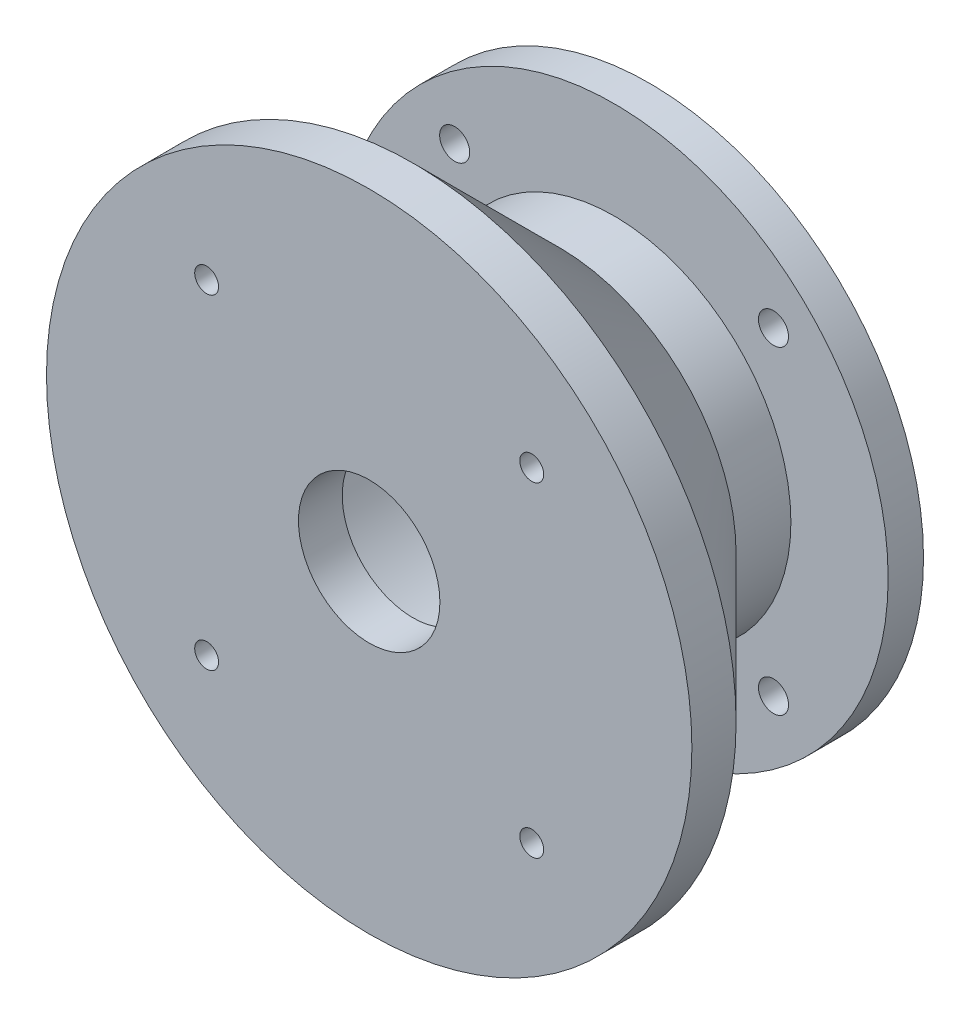
ISO-10303-21;
HEADER;
FILE_DESCRIPTION(('STEP AP214'),'2;1');
FILE_NAME('part.step','',(''),(''),'','','');
FILE_SCHEMA(('AUTOMOTIVE_DESIGN { 1 0 10303 214 1 1 1 1 }'));
ENDSEC;
DATA;
#1=APPLICATION_CONTEXT('core data for automotive mechanical design processes');
#2=APPLICATION_PROTOCOL_DEFINITION('international standard','automotive_design',2000,#1);
#3=PRODUCT_CONTEXT('',#1,'mechanical');
#4=PRODUCT('Part','Part','',(#3));
#5=PRODUCT_RELATED_PRODUCT_CATEGORY('part','',(#4));
#6=PRODUCT_DEFINITION_FORMATION('','',#4);
#7=PRODUCT_DEFINITION_CONTEXT('part definition',#1,'design');
#8=PRODUCT_DEFINITION('design','',#6,#7);
#9=PRODUCT_DEFINITION_SHAPE('','',#8);
#10=(LENGTH_UNIT() NAMED_UNIT(*) SI_UNIT(.MILLI.,.METRE.));
#11=(NAMED_UNIT(*) PLANE_ANGLE_UNIT() SI_UNIT($,.RADIAN.));
#12=(NAMED_UNIT(*) SI_UNIT($,.STERADIAN.) SOLID_ANGLE_UNIT());
#13=UNCERTAINTY_MEASURE_WITH_UNIT(LENGTH_MEASURE(1.E-05),#10,'distance_accuracy_value','');
#14=(GEOMETRIC_REPRESENTATION_CONTEXT(3) GLOBAL_UNCERTAINTY_ASSIGNED_CONTEXT((#13)) GLOBAL_UNIT_ASSIGNED_CONTEXT((#10,
#11,#12)) REPRESENTATION_CONTEXT('',''));
#15=CARTESIAN_POINT('',(0.,0.,0.));
#16=DIRECTION('',(0.,0.,1.));
#17=DIRECTION('',(1.,0.,0.));
#18=AXIS2_PLACEMENT_3D('',#15,#16,#17);
#19=CARTESIAN_POINT('',(138.38477631085,18.38477631085,126.6));
#20=DIRECTION('',(0.,0.,1.));
#21=DIRECTION('',(1.,0.,0.));
#22=AXIS2_PLACEMENT_3D('',#19,#20,#21);
#23=PLANE('',#22);
#24=CARTESIAN_POINT('',(138.38477631085,18.38477631085,126.6));
#25=DIRECTION('',(0.,0.,1.));
#26=DIRECTION('',(1.,0.,0.));
#27=AXIS2_PLACEMENT_3D('',#24,#25,#26);
#28=CIRCLE('',#27,1.35);
#29=CARTESIAN_POINT('',(139.73477631085,18.38477631085,126.6));
#30=VERTEX_POINT('',#29);
#31=EDGE_CURVE('E9',#30,#30,#28,.T.);
#32=ORIENTED_EDGE('',*,*,#31,.T.);
#33=EDGE_LOOP('',(#32));
#34=FACE_BOUND('',#33,.T.);
#35=ADVANCED_FACE('F14',(#34),#23,.T.);
#36=CARTESIAN_POINT('',(101.61522368915,18.38477631085,126.6));
#37=DIRECTION('',(0.,0.,1.));
#38=DIRECTION('',(1.,0.,0.));
#39=AXIS2_PLACEMENT_3D('',#36,#37,#38);
#40=PLANE('',#39);
#41=CARTESIAN_POINT('',(101.61522368915,18.38477631085,126.6));
#42=DIRECTION('',(0.,0.,1.));
#43=DIRECTION('',(1.,0.,0.));
#44=AXIS2_PLACEMENT_3D('',#41,#42,#43);
#45=CIRCLE('',#44,1.35);
#46=CARTESIAN_POINT('',(102.96522368915,18.38477631085,126.6));
#47=VERTEX_POINT('',#46);
#48=EDGE_CURVE('E325',#47,#47,#45,.T.);
#49=ORIENTED_EDGE('',*,*,#48,.T.);
#50=EDGE_LOOP('',(#49));
#51=FACE_BOUND('',#50,.T.);
#52=ADVANCED_FACE('F531',(#51),#40,.T.);
#53=CARTESIAN_POINT('',(138.38477631085,-18.38477631085,126.6));
#54=DIRECTION('',(0.,0.,1.));
#55=DIRECTION('',(1.,0.,0.));
#56=AXIS2_PLACEMENT_3D('',#53,#54,#55);
#57=PLANE('',#56);
#58=CARTESIAN_POINT('',(138.38477631085,-18.38477631085,126.6));
#59=DIRECTION('',(0.,0.,1.));
#60=DIRECTION('',(1.,0.,0.));
#61=AXIS2_PLACEMENT_3D('',#58,#59,#60);
#62=CIRCLE('',#61,1.35);
#63=CARTESIAN_POINT('',(139.73477631085,-18.38477631085,126.6));
#64=VERTEX_POINT('',#63);
#65=EDGE_CURVE('E370',#64,#64,#62,.T.);
#66=ORIENTED_EDGE('',*,*,#65,.T.);
#67=EDGE_LOOP('',(#66));
#68=FACE_BOUND('',#67,.T.);
#69=ADVANCED_FACE('F536',(#68),#57,.T.);
#70=CARTESIAN_POINT('',(101.61522368915,-18.38477631085,126.6));
#71=DIRECTION('',(0.,0.,1.));
#72=DIRECTION('',(1.,0.,0.));
#73=AXIS2_PLACEMENT_3D('',#70,#71,#72);
#74=PLANE('',#73);
#75=CARTESIAN_POINT('',(101.61522368915,-18.38477631085,126.6));
#76=DIRECTION('',(0.,0.,1.));
#77=DIRECTION('',(1.,0.,0.));
#78=AXIS2_PLACEMENT_3D('',#75,#76,#77);
#79=CIRCLE('',#78,1.35);
#80=CARTESIAN_POINT('',(102.96522368915,-18.38477631085,126.6));
#81=VERTEX_POINT('',#80);
#82=EDGE_CURVE('E410',#81,#81,#79,.T.);
#83=ORIENTED_EDGE('',*,*,#82,.T.);
#84=EDGE_LOOP('',(#83));
#85=FACE_BOUND('',#84,.T.);
#86=ADVANCED_FACE('F565',(#85),#74,.T.);
#87=CARTESIAN_POINT('',(138.38477631085,18.38477631085,126.6));
#88=DIRECTION('',(0.,0.,1.));
#89=DIRECTION('',(1.,0.,0.));
#90=AXIS2_PLACEMENT_3D('',#87,#88,#89);
#91=CYLINDRICAL_SURFACE('',#90,1.35);
#92=DIRECTION('',(0.,0.,1.));
#93=VECTOR('',#92,1.);
#94=CARTESIAN_POINT('',(139.73477631085,18.38477631085,126.6));
#95=LINE('',#94,#93);
#96=CARTESIAN_POINT('',(139.73477631085,18.38477631085,131.7));
#97=VERTEX_POINT('',#96);
#98=EDGE_CURVE('E25',#30,#97,#95,.T.);
#99=ORIENTED_EDGE('',*,*,#98,.F.);
#100=ORIENTED_EDGE('',*,*,#31,.F.);
#101=ORIENTED_EDGE('',*,*,#98,.T.);
#102=CARTESIAN_POINT('',(138.38477631085,18.38477631085,131.7));
#103=DIRECTION('',(0.,0.,1.));
#104=DIRECTION('',(1.,0.,0.));
#105=AXIS2_PLACEMENT_3D('',#102,#103,#104);
#106=CIRCLE('',#105,1.35);
#107=EDGE_CURVE('E295',#97,#97,#106,.T.);
#108=ORIENTED_EDGE('',*,*,#107,.T.);
#109=EDGE_LOOP('',(#99,#100,#101,#108));
#110=FACE_BOUND('',#109,.T.);
#111=ADVANCED_FACE('F544',(#110),#91,.F.);
#112=CARTESIAN_POINT('',(101.61522368915,18.38477631085,126.6));
#113=DIRECTION('',(0.,0.,1.));
#114=DIRECTION('',(1.,0.,0.));
#115=AXIS2_PLACEMENT_3D('',#112,#113,#114);
#116=CYLINDRICAL_SURFACE('',#115,1.35);
#117=DIRECTION('',(0.,0.,1.));
#118=VECTOR('',#117,1.);
#119=CARTESIAN_POINT('',(102.96522368915,18.38477631085,126.6));
#120=LINE('',#119,#118);
#121=CARTESIAN_POINT('',(102.96522368915,18.38477631085,131.7));
#122=VERTEX_POINT('',#121);
#123=EDGE_CURVE('E367',#47,#122,#120,.T.);
#124=ORIENTED_EDGE('',*,*,#123,.F.);
#125=ORIENTED_EDGE('',*,*,#48,.F.);
#126=ORIENTED_EDGE('',*,*,#123,.T.);
#127=CARTESIAN_POINT('',(101.61522368915,18.38477631085,131.7));
#128=DIRECTION('',(0.,0.,1.));
#129=DIRECTION('',(1.,0.,0.));
#130=AXIS2_PLACEMENT_3D('',#127,#128,#129);
#131=CIRCLE('',#130,1.35);
#132=EDGE_CURVE('E299',#122,#122,#131,.T.);
#133=ORIENTED_EDGE('',*,*,#132,.T.);
#134=EDGE_LOOP('',(#124,#125,#126,#133));
#135=FACE_BOUND('',#134,.T.);
#136=ADVANCED_FACE('F540',(#135),#116,.F.);
#137=CARTESIAN_POINT('',(138.38477631085,-18.38477631085,126.6));
#138=DIRECTION('',(0.,0.,1.));
#139=DIRECTION('',(1.,0.,0.));
#140=AXIS2_PLACEMENT_3D('',#137,#138,#139);
#141=CYLINDRICAL_SURFACE('',#140,1.35);
#142=DIRECTION('',(0.,0.,1.));
#143=VECTOR('',#142,1.);
#144=CARTESIAN_POINT('',(139.73477631085,-18.38477631085,126.6));
#145=LINE('',#144,#143);
#146=CARTESIAN_POINT('',(139.73477631085,-18.38477631085,131.7));
#147=VERTEX_POINT('',#146);
#148=EDGE_CURVE('E407',#64,#147,#145,.T.);
#149=ORIENTED_EDGE('',*,*,#148,.F.);
#150=ORIENTED_EDGE('',*,*,#65,.F.);
#151=ORIENTED_EDGE('',*,*,#148,.T.);
#152=CARTESIAN_POINT('',(138.38477631085,-18.38477631085,131.7));
#153=DIRECTION('',(0.,0.,1.));
#154=DIRECTION('',(1.,0.,0.));
#155=AXIS2_PLACEMENT_3D('',#152,#153,#154);
#156=CIRCLE('',#155,1.35);
#157=EDGE_CURVE('E339',#147,#147,#156,.T.);
#158=ORIENTED_EDGE('',*,*,#157,.T.);
#159=EDGE_LOOP('',(#149,#150,#151,#158));
#160=FACE_BOUND('',#159,.T.);
#161=ADVANCED_FACE('F543',(#160),#141,.F.);
#162=CARTESIAN_POINT('',(101.61522368915,-18.38477631085,126.6));
#163=DIRECTION('',(0.,0.,1.));
#164=DIRECTION('',(1.,0.,0.));
#165=AXIS2_PLACEMENT_3D('',#162,#163,#164);
#166=CYLINDRICAL_SURFACE('',#165,1.35);
#167=DIRECTION('',(0.,0.,1.));
#168=VECTOR('',#167,1.);
#169=CARTESIAN_POINT('',(102.96522368915,-18.38477631085,126.6));
#170=LINE('',#169,#168);
#171=CARTESIAN_POINT('',(102.96522368915,-18.38477631085,131.7));
#172=VERTEX_POINT('',#171);
#173=EDGE_CURVE('E298',#81,#172,#170,.T.);
#174=ORIENTED_EDGE('',*,*,#173,.F.);
#175=ORIENTED_EDGE('',*,*,#82,.F.);
#176=ORIENTED_EDGE('',*,*,#173,.T.);
#177=CARTESIAN_POINT('',(101.61522368915,-18.38477631085,131.7));
#178=DIRECTION('',(0.,0.,1.));
#179=DIRECTION('',(1.,0.,0.));
#180=AXIS2_PLACEMENT_3D('',#177,#178,#179);
#181=CIRCLE('',#180,1.35);
#182=EDGE_CURVE('E335',#172,#172,#181,.T.);
#183=ORIENTED_EDGE('',*,*,#182,.T.);
#184=EDGE_LOOP('',(#174,#175,#176,#183));
#185=FACE_BOUND('',#184,.T.);
#186=ADVANCED_FACE('F437',(#185),#166,.F.);
#187=CARTESIAN_POINT('',(120.,0.,131.7));
#188=DIRECTION('',(0.,0.,1.));
#189=DIRECTION('',(1.,0.,0.));
#190=AXIS2_PLACEMENT_3D('',#187,#188,#189);
#191=PLANE('',#190);
#192=ORIENTED_EDGE('',*,*,#107,.F.);
#193=EDGE_LOOP('',(#192));
#194=FACE_BOUND('',#193,.T.);
#195=ORIENTED_EDGE('',*,*,#132,.F.);
#196=EDGE_LOOP('',(#195));
#197=FACE_BOUND('',#196,.T.);
#198=CARTESIAN_POINT('',(120.,0.,131.7));
#199=DIRECTION('',(0.,0.,1.));
#200=DIRECTION('',(1.,0.,0.));
#201=AXIS2_PLACEMENT_3D('',#198,#199,#200);
#202=CIRCLE('',#201,8.);
#203=CARTESIAN_POINT('',(128.,0.,131.7));
#204=VERTEX_POINT('',#203);
#205=EDGE_CURVE('E340',#204,#204,#202,.T.);
#206=ORIENTED_EDGE('',*,*,#205,.F.);
#207=EDGE_LOOP('',(#206));
#208=FACE_BOUND('',#207,.T.);
#209=ORIENTED_EDGE('',*,*,#157,.F.);
#210=EDGE_LOOP('',(#209));
#211=FACE_BOUND('',#210,.T.);
#212=ORIENTED_EDGE('',*,*,#182,.F.);
#213=EDGE_LOOP('',(#212));
#214=FACE_BOUND('',#213,.T.);
#215=CARTESIAN_POINT('',(120.,0.,131.7));
#216=DIRECTION('',(0.,0.,1.));
#217=DIRECTION('',(1.,0.,0.));
#218=AXIS2_PLACEMENT_3D('',#215,#216,#217);
#219=CIRCLE('',#218,36.5);
#220=CARTESIAN_POINT('',(156.5,0.,131.7));
#221=VERTEX_POINT('',#220);
#222=EDGE_CURVE('E214',#221,#221,#219,.T.);
#223=ORIENTED_EDGE('',*,*,#222,.T.);
#224=EDGE_LOOP('',(#223));
#225=FACE_BOUND('',#224,.T.);
#226=ADVANCED_FACE('F434',(#194,#197,#208,#211,#214,#225),#191,.T.);
#227=CARTESIAN_POINT('',(120.,0.,126.6));
#228=DIRECTION('',(0.,0.,1.));
#229=DIRECTION('',(1.,0.,0.));
#230=AXIS2_PLACEMENT_3D('',#227,#228,#229);
#231=CYLINDRICAL_SURFACE('',#230,8.);
#232=DIRECTION('',(0.,0.,1.));
#233=VECTOR('',#232,1.);
#234=CARTESIAN_POINT('',(128.,0.,126.6));
#235=LINE('',#234,#233);
#236=CARTESIAN_POINT('',(128.,0.,126.75));
#237=VERTEX_POINT('',#236);
#238=EDGE_CURVE('E349',#237,#204,#235,.T.);
#239=ORIENTED_EDGE('',*,*,#238,.F.);
#240=CARTESIAN_POINT('',(120.,0.,126.75));
#241=DIRECTION('',(0.,0.,1.));
#242=DIRECTION('',(1.,0.,0.));
#243=AXIS2_PLACEMENT_3D('',#240,#241,#242);
#244=CIRCLE('',#243,8.);
#245=EDGE_CURVE('E18',#237,#237,#244,.T.);
#246=ORIENTED_EDGE('',*,*,#245,.F.);
#247=ORIENTED_EDGE('',*,*,#238,.T.);
#248=ORIENTED_EDGE('',*,*,#205,.T.);
#249=EDGE_LOOP('',(#239,#246,#247,#248));
#250=FACE_BOUND('',#249,.T.);
#251=ADVANCED_FACE('F430',(#250),#231,.F.);
#252=CARTESIAN_POINT('',(120.,0.,126.7));
#253=DIRECTION('',(0.,0.,1.));
#254=DIRECTION('',(1.,0.,0.));
#255=AXIS2_PLACEMENT_3D('',#252,#253,#254);
#256=CYLINDRICAL_SURFACE('',#255,36.5);
#257=DIRECTION('',(0.,0.,1.));
#258=VECTOR('',#257,1.);
#259=CARTESIAN_POINT('',(156.5,0.,126.7));
#260=LINE('',#259,#258);
#261=CARTESIAN_POINT('',(156.5,0.,126.7));
#262=VERTEX_POINT('',#261);
#263=EDGE_CURVE('E207',#262,#221,#260,.T.);
#264=ORIENTED_EDGE('',*,*,#263,.T.);
#265=ORIENTED_EDGE('',*,*,#222,.F.);
#266=ORIENTED_EDGE('',*,*,#263,.F.);
#267=CARTESIAN_POINT('',(120.,0.,126.7));
#268=DIRECTION('',(0.,0.,1.));
#269=DIRECTION('',(1.,0.,0.));
#270=AXIS2_PLACEMENT_3D('',#267,#268,#269);
#271=CIRCLE('',#270,36.5);
#272=CARTESIAN_POINT('',(83.996527945211,6.000000000001,126.7));
#273=VERTEX_POINT('',#272);
#274=EDGE_CURVE('E212',#262,#273,#271,.T.);
#275=ORIENTED_EDGE('',*,*,#274,.T.);
#276=CARTESIAN_POINT('',(120.,0.,126.7));
#277=DIRECTION('',(0.,0.,1.));
#278=DIRECTION('',(1.,0.,0.));
#279=AXIS2_PLACEMENT_3D('',#276,#277,#278);
#280=CIRCLE('',#279,36.5);
#281=CARTESIAN_POINT('',(83.996527945211,-6.000000000001,126.7));
#282=VERTEX_POINT('',#281);
#283=EDGE_CURVE('E218',#273,#282,#280,.T.);
#284=ORIENTED_EDGE('',*,*,#283,.T.);
#285=CARTESIAN_POINT('',(120.,0.,126.7));
#286=DIRECTION('',(0.,0.,1.));
#287=DIRECTION('',(1.,0.,0.));
#288=AXIS2_PLACEMENT_3D('',#285,#286,#287);
#289=CIRCLE('',#288,36.5);
#290=EDGE_CURVE('E217',#282,#262,#289,.T.);
#291=ORIENTED_EDGE('',*,*,#290,.T.);
#292=EDGE_LOOP('',(#264,#265,#266,#275,#284,#291));
#293=FACE_BOUND('',#292,.T.);
#294=ADVANCED_FACE('F209',(#293),#256,.T.);
#295=CARTESIAN_POINT('',(120.,0.,126.75));
#296=DIRECTION('',(0.,0.,1.));
#297=DIRECTION('',(1.,0.,0.));
#298=AXIS2_PLACEMENT_3D('',#295,#296,#297);
#299=PLANE('',#298);
#300=ORIENTED_EDGE('',*,*,#245,.T.);
#301=EDGE_LOOP('',(#300));
#302=FACE_BOUND('',#301,.T.);
#303=CARTESIAN_POINT('',(120.,0.,126.75));
#304=DIRECTION('',(0.,0.,1.));
#305=DIRECTION('',(1.,0.,0.));
#306=AXIS2_PLACEMENT_3D('',#303,#304,#305);
#307=CIRCLE('',#306,17.);
#308=CARTESIAN_POINT('',(137.,0.,126.75));
#309=VERTEX_POINT('',#308);
#310=EDGE_CURVE('E250',#309,#309,#307,.T.);
#311=ORIENTED_EDGE('',*,*,#310,.F.);
#312=EDGE_LOOP('',(#311));
#313=FACE_BOUND('',#312,.T.);
#314=ADVANCED_FACE('F562',(#302,#313),#299,.F.);
#315=CARTESIAN_POINT('',(104.,-6.,101.7));
#316=DIRECTION('',(1.,0.,0.));
#317=DIRECTION('',(0.,1.,0.));
#318=AXIS2_PLACEMENT_3D('',#315,#316,#317);
#319=PLANE('',#318);
#320=DIRECTION('',(0.,0.,1.));
#321=VECTOR('',#320,1.);
#322=CARTESIAN_POINT('',(104.,-5.744562646538,99.95));
#323=LINE('',#322,#321);
#324=CARTESIAN_POINT('',(104.,-5.744562646538,101.7));
#325=VERTEX_POINT('',#324);
#326=CARTESIAN_POINT('',(104.,-5.744562646538,126.7));
#327=VERTEX_POINT('',#326);
#328=EDGE_CURVE('E275',#325,#327,#323,.T.);
#329=ORIENTED_EDGE('',*,*,#328,.F.);
#330=DIRECTION('',(0.,1.,0.));
#331=VECTOR('',#330,1.);
#332=CARTESIAN_POINT('',(104.,-6.,101.7));
#333=LINE('',#332,#331);
#334=CARTESIAN_POINT('',(104.,-6.,101.7));
#335=VERTEX_POINT('',#334);
#336=EDGE_CURVE('E267',#335,#325,#333,.T.);
#337=ORIENTED_EDGE('',*,*,#336,.F.);
#338=DIRECTION('',(0.,0.,1.));
#339=VECTOR('',#338,1.);
#340=CARTESIAN_POINT('',(104.,-6.,101.7));
#341=LINE('',#340,#339);
#342=CARTESIAN_POINT('',(104.,-6.,126.7));
#343=VERTEX_POINT('',#342);
#344=EDGE_CURVE('E284',#335,#343,#341,.T.);
#345=ORIENTED_EDGE('',*,*,#344,.T.);
#346=DIRECTION('',(0.,1.,0.));
#347=VECTOR('',#346,1.);
#348=CARTESIAN_POINT('',(104.,-6.,126.7));
#349=LINE('',#348,#347);
#350=EDGE_CURVE('E235',#343,#327,#349,.T.);
#351=ORIENTED_EDGE('',*,*,#350,.T.);
#352=EDGE_LOOP('',(#329,#337,#345,#351));
#353=FACE_BOUND('',#352,.T.);
#354=ADVANCED_FACE('F510',(#353),#319,.F.);
#355=CARTESIAN_POINT('',(120.,0.,110.2));
#356=DIRECTION('',(0.,0.,1.));
#357=DIRECTION('',(1.,0.,0.));
#358=AXIS2_PLACEMENT_3D('',#355,#356,#357);
#359=CONICAL_SURFACE('',#358,20.,0.785398163397);
#360=ORIENTED_EDGE('',*,*,#274,.F.);
#361=ORIENTED_EDGE('',*,*,#290,.F.);
#362=CARTESIAN_POINT('',(83.9965279452386,-6.,126.699999999972));
#363=CARTESIAN_POINT('',(94.9301759622856,-6.,115.915087922201));
#364=CARTESIAN_POINT('',(100.921215971637,-6.,110.200000000022));
#365=(BOUNDED_CURVE() B_SPLINE_CURVE(2,(#362,#363,#364),.UNSPECIFIED.,.F.,
.F.) B_SPLINE_CURVE_WITH_KNOTS((3,3),(0.,1.),
.UNSPECIFIED.) CURVE() GEOMETRIC_REPRESENTATION_ITEM() RATIONAL_B_SPLINE_CURVE((1.,
1.04813016311752,1.)) REPRESENTATION_ITEM(''));
#366=CARTESIAN_POINT('',(100.92121597166,-6.,110.2));
#367=VERTEX_POINT('',#366);
#368=EDGE_CURVE('E294',#282,#367,#365,.T.);
#369=ORIENTED_EDGE('',*,*,#368,.T.);
#370=CARTESIAN_POINT('',(120.,0.,110.2));
#371=DIRECTION('',(0.,0.,-1.));
#372=DIRECTION('',(-0.953939201416951,0.299999999999985,0.));
#373=AXIS2_PLACEMENT_3D('',#370,#371,#372);
#374=CIRCLE('',#373,20.);
#375=CARTESIAN_POINT('',(100.92121597166,6.,110.2));
#376=VERTEX_POINT('',#375);
#377=EDGE_CURVE('E274',#376,#367,#374,.T.);
#378=ORIENTED_EDGE('',*,*,#377,.F.);
#379=CARTESIAN_POINT('',(83.9965279452386,6.,126.699999999972));
#380=CARTESIAN_POINT('',(94.9301759622856,6.,115.915087922201));
#381=CARTESIAN_POINT('',(100.921215971637,6.,110.200000000022));
#382=(BOUNDED_CURVE() B_SPLINE_CURVE(2,(#379,#380,#381),.UNSPECIFIED.,.F.,
.F.) B_SPLINE_CURVE_WITH_KNOTS((3,3),(0.,1.),
.UNSPECIFIED.) CURVE() GEOMETRIC_REPRESENTATION_ITEM() RATIONAL_B_SPLINE_CURVE((1.,
1.04813016311752,1.)) REPRESENTATION_ITEM(''));
#383=EDGE_CURVE('E227',#273,#376,#382,.T.);
#384=ORIENTED_EDGE('',*,*,#383,.F.);
#385=EDGE_LOOP('',(#360,#361,#369,#378,#384));
#386=FACE_BOUND('',#385,.T.);
#387=ADVANCED_FACE('F225',(#386),#359,.T.);
#388=CARTESIAN_POINT('',(82.5,-6.,126.7));
#389=DIRECTION('',(0.,0.,1.));
#390=DIRECTION('',(1.,0.,0.));
#391=AXIS2_PLACEMENT_3D('',#388,#389,#390);
#392=PLANE('',#391);
#393=DIRECTION('',(0.,1.,0.));
#394=VECTOR('',#393,1.);
#395=CARTESIAN_POINT('',(104.,-6.,126.7));
#396=LINE('',#395,#394);
#397=CARTESIAN_POINT('',(104.,5.744562646538,126.7));
#398=VERTEX_POINT('',#397);
#399=CARTESIAN_POINT('',(104.,6.,126.7));
#400=VERTEX_POINT('',#399);
#401=EDGE_CURVE('E362',#398,#400,#396,.T.);
#402=ORIENTED_EDGE('',*,*,#401,.F.);
#403=CARTESIAN_POINT('',(120.,0.,126.7));
#404=DIRECTION('',(0.,0.,1.));
#405=DIRECTION('',(1.,0.,0.));
#406=AXIS2_PLACEMENT_3D('',#403,#404,#405);
#407=CIRCLE('',#406,17.);
#408=EDGE_CURVE('E246',#398,#327,#407,.T.);
#409=ORIENTED_EDGE('',*,*,#408,.T.);
#410=ORIENTED_EDGE('',*,*,#350,.F.);
#411=DIRECTION('',(1.,0.,0.));
#412=VECTOR('',#411,1.);
#413=CARTESIAN_POINT('',(82.5,-6.,126.7));
#414=LINE('',#413,#412);
#415=EDGE_CURVE('E290',#282,#343,#414,.T.);
#416=ORIENTED_EDGE('',*,*,#415,.F.);
#417=ORIENTED_EDGE('',*,*,#283,.F.);
#418=DIRECTION('',(1.,0.,0.));
#419=VECTOR('',#418,1.);
#420=CARTESIAN_POINT('',(82.5,6.,126.7));
#421=LINE('',#420,#419);
#422=EDGE_CURVE('E305',#273,#400,#421,.T.);
#423=ORIENTED_EDGE('',*,*,#422,.T.);
#424=EDGE_LOOP('',(#402,#409,#410,#416,#417,#423));
#425=FACE_BOUND('',#424,.T.);
#426=ADVANCED_FACE('F508',(#425),#392,.F.);
#427=CARTESIAN_POINT('',(104.,-6.,101.7));
#428=DIRECTION('',(1.,0.,0.));
#429=DIRECTION('',(0.,1.,0.));
#430=AXIS2_PLACEMENT_3D('',#427,#428,#429);
#431=PLANE('',#430);
#432=DIRECTION('',(0.,0.,1.));
#433=VECTOR('',#432,1.);
#434=CARTESIAN_POINT('',(104.,6.,101.7));
#435=LINE('',#434,#433);
#436=CARTESIAN_POINT('',(104.,6.,101.7));
#437=VERTEX_POINT('',#436);
#438=EDGE_CURVE('E301',#437,#400,#435,.T.);
#439=ORIENTED_EDGE('',*,*,#438,.F.);
#440=DIRECTION('',(0.,1.,0.));
#441=VECTOR('',#440,1.);
#442=CARTESIAN_POINT('',(104.,-6.,101.7));
#443=LINE('',#442,#441);
#444=CARTESIAN_POINT('',(104.,5.744562646538,101.7));
#445=VERTEX_POINT('',#444);
#446=EDGE_CURVE('E318',#445,#437,#443,.T.);
#447=ORIENTED_EDGE('',*,*,#446,.F.);
#448=DIRECTION('',(0.,0.,1.));
#449=VECTOR('',#448,1.);
#450=CARTESIAN_POINT('',(104.,5.744562646538,99.95));
#451=LINE('',#450,#449);
#452=EDGE_CURVE('E249',#445,#398,#451,.T.);
#453=ORIENTED_EDGE('',*,*,#452,.T.);
#454=ORIENTED_EDGE('',*,*,#401,.T.);
#455=EDGE_LOOP('',(#439,#447,#453,#454));
#456=FACE_BOUND('',#455,.T.);
#457=ADVANCED_FACE('F505',(#456),#431,.F.);
#458=CARTESIAN_POINT('',(120.,0.,100.));
#459=DIRECTION('',(0.,0.,1.));
#460=DIRECTION('',(1.,0.,0.));
#461=AXIS2_PLACEMENT_3D('',#458,#459,#460);
#462=CYLINDRICAL_SURFACE('',#461,20.);
#463=CARTESIAN_POINT('',(120.,0.,104.));
#464=DIRECTION('',(0.,0.,-1.));
#465=DIRECTION('',(-0.953939201416951,0.299999999999985,0.));
#466=AXIS2_PLACEMENT_3D('',#463,#464,#465);
#467=CIRCLE('',#466,20.);
#468=CARTESIAN_POINT('',(100.92121597166,6.,104.));
#469=VERTEX_POINT('',#468);
#470=CARTESIAN_POINT('',(100.92121597166,-6.,104.));
#471=VERTEX_POINT('',#470);
#472=EDGE_CURVE('E345',#469,#471,#467,.T.);
#473=ORIENTED_EDGE('',*,*,#472,.F.);
#474=DIRECTION('',(0.,0.,1.));
#475=VECTOR('',#474,1.);
#476=CARTESIAN_POINT('',(100.92121597166,6.,100.));
#477=LINE('',#476,#475);
#478=EDGE_CURVE('E245',#469,#376,#477,.T.);
#479=ORIENTED_EDGE('',*,*,#478,.T.);
#480=ORIENTED_EDGE('',*,*,#377,.T.);
#481=DIRECTION('',(0.,0.,1.));
#482=VECTOR('',#481,1.);
#483=CARTESIAN_POINT('',(100.92121597166,-6.,100.));
#484=LINE('',#483,#482);
#485=EDGE_CURVE('E311',#471,#367,#484,.T.);
#486=ORIENTED_EDGE('',*,*,#485,.F.);
#487=EDGE_LOOP('',(#473,#479,#480,#486));
#488=FACE_BOUND('',#487,.T.);
#489=ADVANCED_FACE('F16',(#488),#462,.T.);
#490=CARTESIAN_POINT('',(138.03122292025,18.031222920257,99.9));
#491=DIRECTION('',(0.,0.,1.));
#492=DIRECTION('',(1.,0.,0.));
#493=AXIS2_PLACEMENT_3D('',#490,#491,#492);
#494=CYLINDRICAL_SURFACE('',#493,1.7);
#495=DIRECTION('',(0.,0.,1.));
#496=VECTOR('',#495,1.);
#497=CARTESIAN_POINT('',(139.73122292025,18.031222920257,99.9));
#498=LINE('',#497,#496);
#499=CARTESIAN_POINT('',(139.73122292025,18.031222920257,100.));
#500=VERTEX_POINT('',#499);
#501=CARTESIAN_POINT('',(139.73122292025,18.031222920257,104.));
#502=VERTEX_POINT('',#501);
#503=EDGE_CURVE('E53',#500,#502,#498,.T.);
#504=ORIENTED_EDGE('',*,*,#503,.F.);
#505=CARTESIAN_POINT('',(138.03122292025,18.031222920257,100.));
#506=DIRECTION('',(0.,0.,1.));
#507=DIRECTION('',(1.,0.,0.));
#508=AXIS2_PLACEMENT_3D('',#505,#506,#507);
#509=CIRCLE('',#508,1.7);
#510=EDGE_CURVE('E239',#500,#500,#509,.T.);
#511=ORIENTED_EDGE('',*,*,#510,.F.);
#512=ORIENTED_EDGE('',*,*,#503,.T.);
#513=CARTESIAN_POINT('',(138.03122292025,18.031222920257,104.));
#514=DIRECTION('',(0.,0.,1.));
#515=DIRECTION('',(1.,0.,0.));
#516=AXIS2_PLACEMENT_3D('',#513,#514,#515);
#517=CIRCLE('',#516,1.7);
#518=EDGE_CURVE('E306',#502,#502,#517,.T.);
#519=ORIENTED_EDGE('',*,*,#518,.T.);
#520=EDGE_LOOP('',(#504,#511,#512,#519));
#521=FACE_BOUND('',#520,.T.);
#522=ADVANCED_FACE('F515',(#521),#494,.F.);
#523=CARTESIAN_POINT('',(120.,0.,99.95));
#524=DIRECTION('',(0.,0.,1.));
#525=DIRECTION('',(1.,0.,0.));
#526=AXIS2_PLACEMENT_3D('',#523,#524,#525);
#527=CYLINDRICAL_SURFACE('',#526,17.);
#528=ORIENTED_EDGE('',*,*,#408,.F.);
#529=ORIENTED_EDGE('',*,*,#452,.F.);
#530=CARTESIAN_POINT('',(120.,0.,101.7));
#531=DIRECTION('',(0.,0.,1.));
#532=DIRECTION('',(1.,0.,0.));
#533=AXIS2_PLACEMENT_3D('',#530,#531,#532);
#534=CIRCLE('',#533,17.);
#535=EDGE_CURVE('E271',#445,#325,#534,.T.);
#536=ORIENTED_EDGE('',*,*,#535,.T.);
#537=ORIENTED_EDGE('',*,*,#328,.T.);
#538=EDGE_LOOP('',(#528,#529,#536,#537));
#539=FACE_BOUND('',#538,.T.);
#540=DIRECTION('',(0.,0.,1.));
#541=VECTOR('',#540,1.);
#542=CARTESIAN_POINT('',(137.,0.,99.95));
#543=LINE('',#542,#541);
#544=CARTESIAN_POINT('',(137.,0.,100.));
#545=VERTEX_POINT('',#544);
#546=EDGE_CURVE('E254',#545,#309,#543,.T.);
#547=ORIENTED_EDGE('',*,*,#546,.T.);
#548=ORIENTED_EDGE('',*,*,#310,.T.);
#549=ORIENTED_EDGE('',*,*,#546,.F.);
#550=CARTESIAN_POINT('',(120.,0.,100.));
#551=DIRECTION('',(0.,0.,1.));
#552=DIRECTION('',(1.,0.,0.));
#553=AXIS2_PLACEMENT_3D('',#550,#551,#552);
#554=CIRCLE('',#553,17.);
#555=EDGE_CURVE('E256',#545,#545,#554,.T.);
#556=ORIENTED_EDGE('',*,*,#555,.F.);
#557=EDGE_LOOP('',(#547,#548,#549,#556));
#558=FACE_BOUND('',#557,.T.);
#559=ADVANCED_FACE('F512',(#539,#558),#527,.F.);
#560=CARTESIAN_POINT('',(101.96877707974,18.031222920257,99.9));
#561=DIRECTION('',(0.,0.,1.));
#562=DIRECTION('',(1.,0.,0.));
#563=AXIS2_PLACEMENT_3D('',#560,#561,#562);
#564=CYLINDRICAL_SURFACE('',#563,1.7);
#565=DIRECTION('',(0.,0.,1.));
#566=VECTOR('',#565,1.);
#567=CARTESIAN_POINT('',(103.66877707974,18.031222920257,99.9));
#568=LINE('',#567,#566);
#569=CARTESIAN_POINT('',(103.66877707974,18.031222920257,100.));
#570=VERTEX_POINT('',#569);
#571=CARTESIAN_POINT('',(103.66877707974,18.031222920257,104.));
#572=VERTEX_POINT('',#571);
#573=EDGE_CURVE('E69',#570,#572,#568,.T.);
#574=ORIENTED_EDGE('',*,*,#573,.F.);
#575=CARTESIAN_POINT('',(101.96877707974,18.031222920257,100.));
#576=DIRECTION('',(0.,0.,1.));
#577=DIRECTION('',(1.,0.,0.));
#578=AXIS2_PLACEMENT_3D('',#575,#576,#577);
#579=CIRCLE('',#578,1.7);
#580=EDGE_CURVE('E260',#570,#570,#579,.T.);
#581=ORIENTED_EDGE('',*,*,#580,.F.);
#582=ORIENTED_EDGE('',*,*,#573,.T.);
#583=CARTESIAN_POINT('',(101.96877707974,18.031222920257,104.));
#584=DIRECTION('',(0.,0.,1.));
#585=DIRECTION('',(1.,0.,0.));
#586=AXIS2_PLACEMENT_3D('',#583,#584,#585);
#587=CIRCLE('',#586,1.7);
#588=EDGE_CURVE('E379',#572,#572,#587,.T.);
#589=ORIENTED_EDGE('',*,*,#588,.T.);
#590=EDGE_LOOP('',(#574,#581,#582,#589));
#591=FACE_BOUND('',#590,.T.);
#592=ADVANCED_FACE('F469',(#591),#564,.F.);
#593=CARTESIAN_POINT('',(138.03122292025,-18.03122292025,99.9));
#594=DIRECTION('',(0.,0.,1.));
#595=DIRECTION('',(1.,0.,0.));
#596=AXIS2_PLACEMENT_3D('',#593,#594,#595);
#597=CYLINDRICAL_SURFACE('',#596,1.7);
#598=DIRECTION('',(0.,0.,1.));
#599=VECTOR('',#598,1.);
#600=CARTESIAN_POINT('',(139.73122292025,-18.03122292025,99.9));
#601=LINE('',#600,#599);
#602=CARTESIAN_POINT('',(139.73122292025,-18.03122292025,100.));
#603=VERTEX_POINT('',#602);
#604=CARTESIAN_POINT('',(139.73122292025,-18.03122292025,104.));
#605=VERTEX_POINT('',#604);
#606=EDGE_CURVE('E255',#603,#605,#601,.T.);
#607=ORIENTED_EDGE('',*,*,#606,.F.);
#608=CARTESIAN_POINT('',(138.03122292025,-18.03122292025,100.));
#609=DIRECTION('',(0.,0.,1.));
#610=DIRECTION('',(1.,0.,0.));
#611=AXIS2_PLACEMENT_3D('',#608,#609,#610);
#612=CIRCLE('',#611,1.7);
#613=EDGE_CURVE('E265',#603,#603,#612,.T.);
#614=ORIENTED_EDGE('',*,*,#613,.F.);
#615=ORIENTED_EDGE('',*,*,#606,.T.);
#616=CARTESIAN_POINT('',(138.03122292025,-18.03122292025,104.));
#617=DIRECTION('',(0.,0.,1.));
#618=DIRECTION('',(1.,0.,0.));
#619=AXIS2_PLACEMENT_3D('',#616,#617,#618);
#620=CIRCLE('',#619,1.7);
#621=EDGE_CURVE('E375',#605,#605,#620,.T.);
#622=ORIENTED_EDGE('',*,*,#621,.T.);
#623=EDGE_LOOP('',(#607,#614,#615,#622));
#624=FACE_BOUND('',#623,.T.);
#625=ADVANCED_FACE('F554',(#624),#597,.F.);
#626=CARTESIAN_POINT('',(101.96877707974,-18.03122292025,99.9));
#627=DIRECTION('',(0.,0.,1.));
#628=DIRECTION('',(1.,0.,0.));
#629=AXIS2_PLACEMENT_3D('',#626,#627,#628);
#630=CYLINDRICAL_SURFACE('',#629,1.7);
#631=DIRECTION('',(0.,0.,1.));
#632=VECTOR('',#631,1.);
#633=CARTESIAN_POINT('',(103.66877707974,-18.03122292025,99.9));
#634=LINE('',#633,#632);
#635=CARTESIAN_POINT('',(103.66877707974,-18.03122292025,100.));
#636=VERTEX_POINT('',#635);
#637=CARTESIAN_POINT('',(103.66877707974,-18.03122292025,104.));
#638=VERTEX_POINT('',#637);
#639=EDGE_CURVE('E281',#636,#638,#634,.T.);
#640=ORIENTED_EDGE('',*,*,#639,.F.);
#641=CARTESIAN_POINT('',(101.96877707974,-18.03122292025,100.));
#642=DIRECTION('',(0.,0.,1.));
#643=DIRECTION('',(1.,0.,0.));
#644=AXIS2_PLACEMENT_3D('',#641,#642,#643);
#645=CIRCLE('',#644,1.7);
#646=EDGE_CURVE('E261',#636,#636,#645,.T.);
#647=ORIENTED_EDGE('',*,*,#646,.F.);
#648=ORIENTED_EDGE('',*,*,#639,.T.);
#649=CARTESIAN_POINT('',(101.96877707974,-18.03122292025,104.));
#650=DIRECTION('',(0.,0.,1.));
#651=DIRECTION('',(1.,0.,0.));
#652=AXIS2_PLACEMENT_3D('',#649,#650,#651);
#653=CIRCLE('',#652,1.7);
#654=EDGE_CURVE('E344',#638,#638,#653,.T.);
#655=ORIENTED_EDGE('',*,*,#654,.T.);
#656=EDGE_LOOP('',(#640,#647,#648,#655));
#657=FACE_BOUND('',#656,.T.);
#658=ADVANCED_FACE('F551',(#657),#630,.F.);
#659=CARTESIAN_POINT('',(82.5,-6.,101.7));
#660=DIRECTION('',(0.,1.,0.));
#661=DIRECTION('',(1.,0.,0.));
#662=AXIS2_PLACEMENT_3D('',#659,#660,#661);
#663=PLANE('',#662);
#664=DIRECTION('',(1.,0.,0.));
#665=VECTOR('',#664,1.);
#666=CARTESIAN_POINT('',(82.5,-6.,101.7));
#667=LINE('',#666,#665);
#668=CARTESIAN_POINT('',(89.586187348509,-6.,101.7));
#669=VERTEX_POINT('',#668);
#670=EDGE_CURVE('E244',#669,#335,#667,.T.);
#671=ORIENTED_EDGE('',*,*,#670,.F.);
#672=DIRECTION('',(0.,0.,1.));
#673=VECTOR('',#672,1.);
#674=CARTESIAN_POINT('',(89.586187348509,-6.,100.));
#675=LINE('',#674,#673);
#676=CARTESIAN_POINT('',(89.586187348509,-6.,104.));
#677=VERTEX_POINT('',#676);
#678=EDGE_CURVE('E361',#669,#677,#675,.T.);
#679=ORIENTED_EDGE('',*,*,#678,.T.);
#680=DIRECTION('',(-1.,0.,0.));
#681=VECTOR('',#680,1.);
#682=CARTESIAN_POINT('',(101.25,-6.,104.));
#683=LINE('',#682,#681);
#684=EDGE_CURVE('E341',#471,#677,#683,.T.);
#685=ORIENTED_EDGE('',*,*,#684,.F.);
#686=ORIENTED_EDGE('',*,*,#485,.T.);
#687=ORIENTED_EDGE('',*,*,#368,.F.);
#688=ORIENTED_EDGE('',*,*,#415,.T.);
#689=ORIENTED_EDGE('',*,*,#344,.F.);
#690=EDGE_LOOP('',(#671,#679,#685,#686,#687,#688,#689));
#691=FACE_BOUND('',#690,.T.);
#692=ADVANCED_FACE('F498',(#691),#663,.T.);
#693=CARTESIAN_POINT('',(82.5,-6.,101.7));
#694=DIRECTION('',(0.,0.,1.));
#695=DIRECTION('',(1.,0.,0.));
#696=AXIS2_PLACEMENT_3D('',#693,#694,#695);
#697=PLANE('',#696);
#698=DIRECTION('',(1.,0.,0.));
#699=VECTOR('',#698,1.);
#700=CARTESIAN_POINT('',(82.5,6.,101.7));
#701=LINE('',#700,#699);
#702=CARTESIAN_POINT('',(89.586187348509,6.,101.7));
#703=VERTEX_POINT('',#702);
#704=EDGE_CURVE('E241',#703,#437,#701,.T.);
#705=ORIENTED_EDGE('',*,*,#704,.F.);
#706=CARTESIAN_POINT('',(120.,0.,101.7));
#707=DIRECTION('',(0.,0.,1.));
#708=DIRECTION('',(1.,0.,0.));
#709=AXIS2_PLACEMENT_3D('',#706,#707,#708);
#710=CIRCLE('',#709,31.);
#711=EDGE_CURVE('E371',#703,#669,#710,.T.);
#712=ORIENTED_EDGE('',*,*,#711,.T.);
#713=ORIENTED_EDGE('',*,*,#670,.T.);
#714=ORIENTED_EDGE('',*,*,#336,.T.);
#715=ORIENTED_EDGE('',*,*,#535,.F.);
#716=ORIENTED_EDGE('',*,*,#446,.T.);
#717=EDGE_LOOP('',(#705,#712,#713,#714,#715,#716));
#718=FACE_BOUND('',#717,.T.);
#719=ADVANCED_FACE('F501',(#718),#697,.T.);
#720=CARTESIAN_POINT('',(82.5,6.,101.7));
#721=DIRECTION('',(0.,1.,0.));
#722=DIRECTION('',(1.,0.,0.));
#723=AXIS2_PLACEMENT_3D('',#720,#721,#722);
#724=PLANE('',#723);
#725=ORIENTED_EDGE('',*,*,#438,.T.);
#726=ORIENTED_EDGE('',*,*,#422,.F.);
#727=ORIENTED_EDGE('',*,*,#383,.T.);
#728=ORIENTED_EDGE('',*,*,#478,.F.);
#729=DIRECTION('',(-1.,0.,0.));
#730=VECTOR('',#729,1.);
#731=CARTESIAN_POINT('',(101.25,6.,104.));
#732=LINE('',#731,#730);
#733=CARTESIAN_POINT('',(89.586187348509,6.,104.));
#734=VERTEX_POINT('',#733);
#735=EDGE_CURVE('E346',#469,#734,#732,.T.);
#736=ORIENTED_EDGE('',*,*,#735,.T.);
#737=DIRECTION('',(0.,0.,1.));
#738=VECTOR('',#737,1.);
#739=CARTESIAN_POINT('',(89.586187348509,6.,100.));
#740=LINE('',#739,#738);
#741=EDGE_CURVE('E280',#703,#734,#740,.T.);
#742=ORIENTED_EDGE('',*,*,#741,.F.);
#743=ORIENTED_EDGE('',*,*,#704,.T.);
#744=EDGE_LOOP('',(#725,#726,#727,#728,#736,#742,#743));
#745=FACE_BOUND('',#744,.T.);
#746=ADVANCED_FACE('F475',(#745),#724,.F.);
#747=CARTESIAN_POINT('',(120.,0.,104.));
#748=DIRECTION('',(0.,0.,1.));
#749=DIRECTION('',(1.,0.,0.));
#750=AXIS2_PLACEMENT_3D('',#747,#748,#749);
#751=PLANE('',#750);
#752=ORIENTED_EDGE('',*,*,#518,.F.);
#753=EDGE_LOOP('',(#752));
#754=FACE_BOUND('',#753,.T.);
#755=ORIENTED_EDGE('',*,*,#588,.F.);
#756=EDGE_LOOP('',(#755));
#757=FACE_BOUND('',#756,.T.);
#758=ORIENTED_EDGE('',*,*,#621,.F.);
#759=EDGE_LOOP('',(#758));
#760=FACE_BOUND('',#759,.T.);
#761=ORIENTED_EDGE('',*,*,#654,.F.);
#762=EDGE_LOOP('',(#761));
#763=FACE_BOUND('',#762,.T.);
#764=CARTESIAN_POINT('',(120.,0.,104.));
#765=DIRECTION('',(0.,0.,1.));
#766=DIRECTION('',(1.,0.,0.));
#767=AXIS2_PLACEMENT_3D('',#764,#765,#766);
#768=CIRCLE('',#767,31.);
#769=CARTESIAN_POINT('',(151.,0.,104.));
#770=VERTEX_POINT('',#769);
#771=EDGE_CURVE('E357',#677,#770,#768,.T.);
#772=ORIENTED_EDGE('',*,*,#771,.T.);
#773=CARTESIAN_POINT('',(120.,0.,104.));
#774=DIRECTION('',(0.,0.,1.));
#775=DIRECTION('',(1.,0.,0.));
#776=AXIS2_PLACEMENT_3D('',#773,#774,#775);
#777=CIRCLE('',#776,31.);
#778=EDGE_CURVE('E276',#770,#734,#777,.T.);
#779=ORIENTED_EDGE('',*,*,#778,.T.);
#780=ORIENTED_EDGE('',*,*,#735,.F.);
#781=ORIENTED_EDGE('',*,*,#472,.T.);
#782=ORIENTED_EDGE('',*,*,#684,.T.);
#783=EDGE_LOOP('',(#772,#779,#780,#781,#782));
#784=FACE_BOUND('',#783,.T.);
#785=ADVANCED_FACE('F472',(#754,#757,#760,#763,#784),#751,.T.);
#786=CARTESIAN_POINT('',(120.,0.,100.));
#787=DIRECTION('',(0.,0.,1.));
#788=DIRECTION('',(1.,0.,0.));
#789=AXIS2_PLACEMENT_3D('',#786,#787,#788);
#790=PLANE('',#789);
#791=ORIENTED_EDGE('',*,*,#510,.T.);
#792=EDGE_LOOP('',(#791));
#793=FACE_BOUND('',#792,.T.);
#794=ORIENTED_EDGE('',*,*,#555,.T.);
#795=EDGE_LOOP('',(#794));
#796=FACE_BOUND('',#795,.T.);
#797=ORIENTED_EDGE('',*,*,#580,.T.);
#798=EDGE_LOOP('',(#797));
#799=FACE_BOUND('',#798,.T.);
#800=ORIENTED_EDGE('',*,*,#613,.T.);
#801=EDGE_LOOP('',(#800));
#802=FACE_BOUND('',#801,.T.);
#803=ORIENTED_EDGE('',*,*,#646,.T.);
#804=EDGE_LOOP('',(#803));
#805=FACE_BOUND('',#804,.T.);
#806=CARTESIAN_POINT('',(120.,0.,100.));
#807=DIRECTION('',(0.,0.,1.));
#808=DIRECTION('',(1.,0.,0.));
#809=AXIS2_PLACEMENT_3D('',#806,#807,#808);
#810=CIRCLE('',#809,31.);
#811=CARTESIAN_POINT('',(151.,0.,100.));
#812=VERTEX_POINT('',#811);
#813=EDGE_CURVE('E266',#812,#812,#810,.T.);
#814=ORIENTED_EDGE('',*,*,#813,.F.);
#815=EDGE_LOOP('',(#814));
#816=FACE_BOUND('',#815,.T.);
#817=ADVANCED_FACE('F467',(#793,#796,#799,#802,#805,#816),#790,.F.);
#818=CARTESIAN_POINT('',(120.,0.,100.));
#819=DIRECTION('',(0.,0.,1.));
#820=DIRECTION('',(1.,0.,0.));
#821=AXIS2_PLACEMENT_3D('',#818,#819,#820);
#822=CYLINDRICAL_SURFACE('',#821,31.);
#823=DIRECTION('',(0.,0.,1.));
#824=VECTOR('',#823,1.);
#825=CARTESIAN_POINT('',(151.,0.,100.));
#826=LINE('',#825,#824);
#827=EDGE_CURVE('E353',#812,#770,#826,.T.);
#828=ORIENTED_EDGE('',*,*,#827,.T.);
#829=ORIENTED_EDGE('',*,*,#771,.F.);
#830=ORIENTED_EDGE('',*,*,#678,.F.);
#831=ORIENTED_EDGE('',*,*,#711,.F.);
#832=ORIENTED_EDGE('',*,*,#741,.T.);
#833=ORIENTED_EDGE('',*,*,#778,.F.);
#834=ORIENTED_EDGE('',*,*,#827,.F.);
#835=ORIENTED_EDGE('',*,*,#813,.T.);
#836=EDGE_LOOP('',(#828,#829,#830,#831,#832,#833,#834,#835));
#837=FACE_BOUND('',#836,.T.);
#838=ADVANCED_FACE('F488',(#837),#822,.T.);
#839=CLOSED_SHELL('',(#35,#52,#69,#86,#111,#136,#161,#186,#226,#251,#294,#314,#354,#387,#426,
#457,#489,#522,#559,#592,#625,#658,#692,#719,#746,#785,#817,#838));
#840=MANIFOLD_SOLID_BREP('B1',#839);
#841=ADVANCED_BREP_SHAPE_REPRESENTATION('',(#18,#840),#14);
#842=SHAPE_DEFINITION_REPRESENTATION(#9,#841);
ENDSEC;
END-ISO-10303-21;
